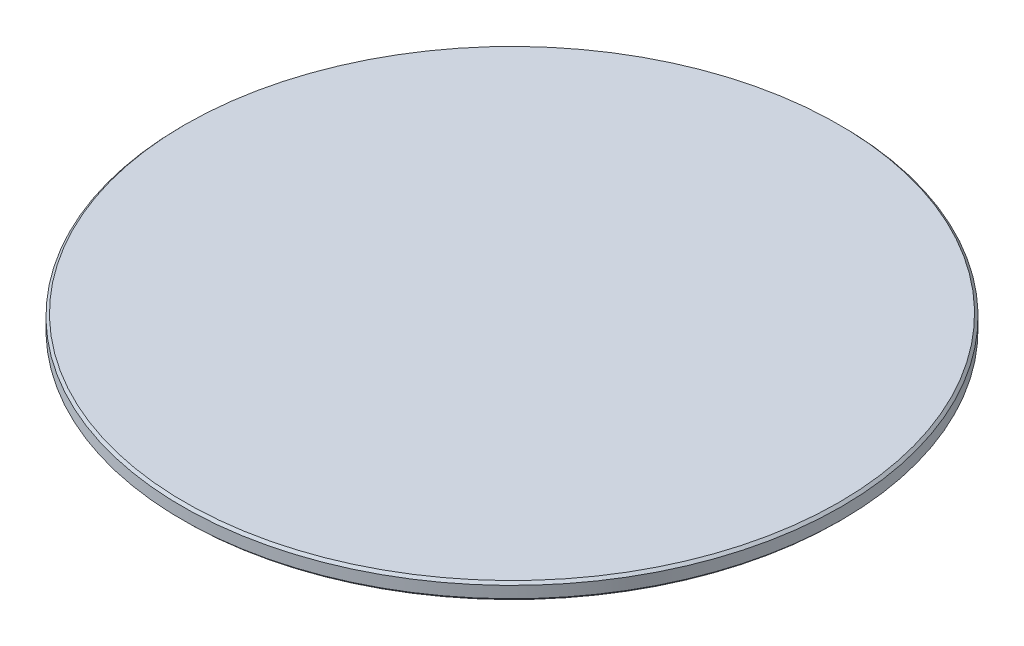
ISO-10303-21;
HEADER;
FILE_DESCRIPTION(('STEP AP214'),'2;1');
FILE_NAME('part.step','',(''),(''),'','','');
FILE_SCHEMA(('AUTOMOTIVE_DESIGN { 1 0 10303 214 1 1 1 1 }'));
ENDSEC;
DATA;
#1=APPLICATION_CONTEXT('core data for automotive mechanical design processes');
#2=APPLICATION_PROTOCOL_DEFINITION('international standard','automotive_design',2000,#1);
#3=PRODUCT_CONTEXT('',#1,'mechanical');
#4=PRODUCT('Part','Part','',(#3));
#5=PRODUCT_RELATED_PRODUCT_CATEGORY('part','',(#4));
#6=PRODUCT_DEFINITION_FORMATION('','',#4);
#7=PRODUCT_DEFINITION_CONTEXT('part definition',#1,'design');
#8=PRODUCT_DEFINITION('design','',#6,#7);
#9=PRODUCT_DEFINITION_SHAPE('','',#8);
#10=(LENGTH_UNIT() NAMED_UNIT(*) SI_UNIT(.MILLI.,.METRE.));
#11=(NAMED_UNIT(*) PLANE_ANGLE_UNIT() SI_UNIT($,.RADIAN.));
#12=(NAMED_UNIT(*) SI_UNIT($,.STERADIAN.) SOLID_ANGLE_UNIT());
#13=UNCERTAINTY_MEASURE_WITH_UNIT(LENGTH_MEASURE(1.E-05),#10,'distance_accuracy_value','');
#14=(GEOMETRIC_REPRESENTATION_CONTEXT(3) GLOBAL_UNCERTAINTY_ASSIGNED_CONTEXT((#13)) GLOBAL_UNIT_ASSIGNED_CONTEXT((#10,
#11,#12)) REPRESENTATION_CONTEXT('',''));
#15=CARTESIAN_POINT('',(0.,0.,0.));
#16=DIRECTION('',(0.,0.,1.));
#17=DIRECTION('',(1.,0.,0.));
#18=AXIS2_PLACEMENT_3D('',#15,#16,#17);
#19=CARTESIAN_POINT('',(0.,0.,0.));
#20=DIRECTION('',(0.,1.,0.));
#21=DIRECTION('',(-1.,0.,0.));
#22=AXIS2_PLACEMENT_3D('',#19,#20,#21);
#23=PLANE('',#22);
#24=CARTESIAN_POINT('',(0.,0.,0.));
#25=DIRECTION('',(0.,1.,0.));
#26=DIRECTION('',(-1.,0.,0.));
#27=AXIS2_PLACEMENT_3D('',#24,#25,#26);
#28=CIRCLE('',#27,19.85);
#29=CARTESIAN_POINT('',(-19.85,0.,0.));
#30=VERTEX_POINT('',#29);
#31=EDGE_CURVE('E10',#30,#30,#28,.T.);
#32=ORIENTED_EDGE('',*,*,#31,.F.);
#33=EDGE_LOOP('',(#32));
#34=FACE_BOUND('',#33,.T.);
#35=ADVANCED_FACE('F40',(#34),#23,.F.);
#36=CARTESIAN_POINT('',(0.,0.,0.));
#37=DIRECTION('',(0.,1.,0.));
#38=DIRECTION('',(-1.,0.,0.));
#39=AXIS2_PLACEMENT_3D('',#36,#37,#38);
#40=CONICAL_SURFACE('',#39,19.85,0.785398163397451);
#41=CARTESIAN_POINT('',(0.,0.150000000000002,0.));
#42=DIRECTION('',(0.,1.,0.));
#43=DIRECTION('',(-1.,0.,0.));
#44=AXIS2_PLACEMENT_3D('',#41,#42,#43);
#45=CIRCLE('',#44,20.);
#46=CARTESIAN_POINT('',(-20.,0.150000000000005,0.));
#47=VERTEX_POINT('',#46);
#48=EDGE_CURVE('E43',#47,#47,#45,.T.);
#49=ORIENTED_EDGE('',*,*,#48,.F.);
#50=EDGE_LOOP('',(#49));
#51=FACE_BOUND('',#50,.T.);
#52=ORIENTED_EDGE('',*,*,#31,.T.);
#53=EDGE_LOOP('',(#52));
#54=FACE_BOUND('',#53,.T.);
#55=ADVANCED_FACE('F70',(#51,#54),#40,.T.);
#56=CARTESIAN_POINT('',(0.,1.,0.));
#57=DIRECTION('',(0.,1.,0.));
#58=DIRECTION('',(-1.,0.,0.));
#59=AXIS2_PLACEMENT_3D('',#56,#57,#58);
#60=CYLINDRICAL_SURFACE('',#59,20.);
#61=CARTESIAN_POINT('',(0.,0.850000000000005,0.));
#62=DIRECTION('',(0.,1.,0.));
#63=DIRECTION('',(-1.,0.,0.));
#64=AXIS2_PLACEMENT_3D('',#61,#62,#63);
#65=CIRCLE('',#64,20.);
#66=CARTESIAN_POINT('',(-20.,0.850000000000008,0.));
#67=VERTEX_POINT('',#66);
#68=EDGE_CURVE('E50',#67,#67,#65,.T.);
#69=ORIENTED_EDGE('',*,*,#68,.F.);
#70=EDGE_LOOP('',(#69));
#71=FACE_BOUND('',#70,.T.);
#72=ORIENTED_EDGE('',*,*,#48,.T.);
#73=EDGE_LOOP('',(#72));
#74=FACE_BOUND('',#73,.T.);
#75=ADVANCED_FACE('F65',(#71,#74),#60,.T.);
#76=CARTESIAN_POINT('',(0.,0.850000000000005,0.));
#77=DIRECTION('',(0.,-1.,0.));
#78=DIRECTION('',(1.,0.,0.));
#79=AXIS2_PLACEMENT_3D('',#76,#77,#78);
#80=CONICAL_SURFACE('',#79,20.,0.785398163397451);
#81=CARTESIAN_POINT('',(0.,1.00000000000001,0.));
#82=DIRECTION('',(0.,1.,0.));
#83=DIRECTION('',(-1.,0.,0.));
#84=AXIS2_PLACEMENT_3D('',#81,#82,#83);
#85=CIRCLE('',#84,19.85);
#86=CARTESIAN_POINT('',(-19.85,1.00000000000001,0.));
#87=VERTEX_POINT('',#86);
#88=EDGE_CURVE('E51',#87,#87,#85,.T.);
#89=ORIENTED_EDGE('',*,*,#88,.F.);
#90=EDGE_LOOP('',(#89));
#91=FACE_BOUND('',#90,.T.);
#92=ORIENTED_EDGE('',*,*,#68,.T.);
#93=EDGE_LOOP('',(#92));
#94=FACE_BOUND('',#93,.T.);
#95=ADVANCED_FACE('F56',(#91,#94),#80,.T.);
#96=CARTESIAN_POINT('',(19.85,1.,0.));
#97=DIRECTION('',(0.,-1.,0.));
#98=DIRECTION('',(1.,0.,0.));
#99=AXIS2_PLACEMENT_3D('',#96,#97,#98);
#100=PLANE('',#99);
#101=ORIENTED_EDGE('',*,*,#88,.T.);
#102=EDGE_LOOP('',(#101));
#103=FACE_BOUND('',#102,.T.);
#104=ADVANCED_FACE('F60',(#103),#100,.F.);
#105=CLOSED_SHELL('',(#35,#55,#75,#95,#104));
#106=MANIFOLD_SOLID_BREP('B2',#105);
#107=ADVANCED_BREP_SHAPE_REPRESENTATION('',(#18,#106),#14);
#108=SHAPE_DEFINITION_REPRESENTATION(#9,#107);
ENDSEC;
END-ISO-10303-21;
